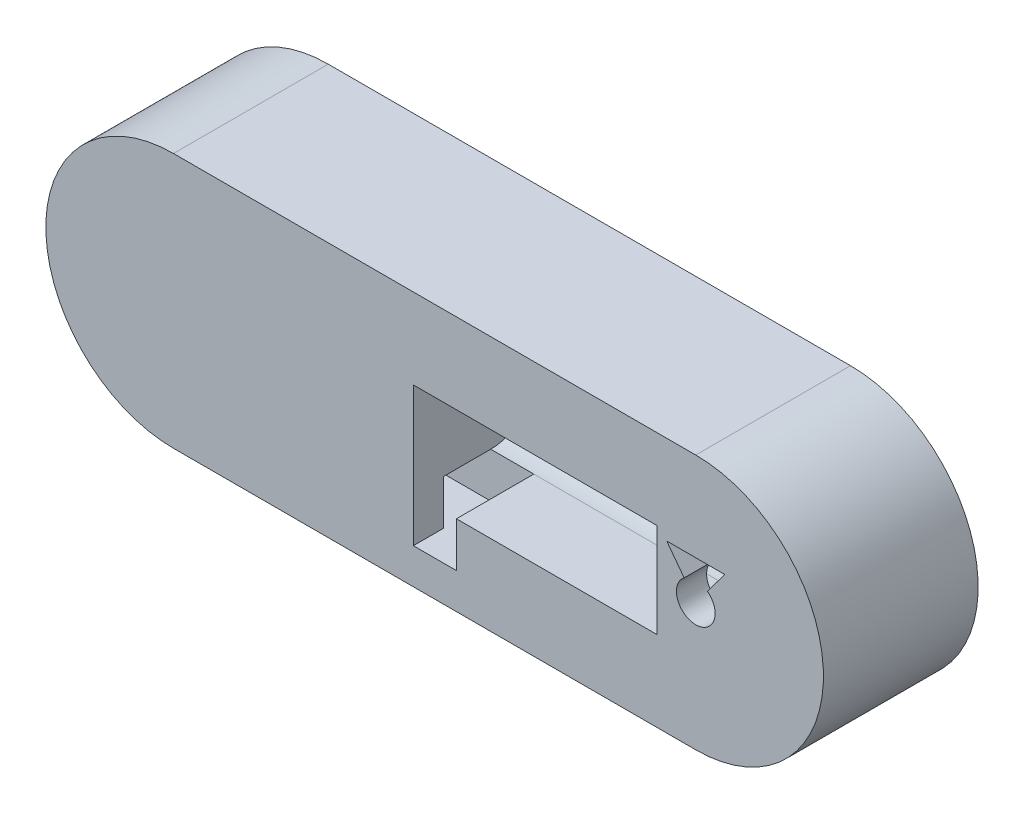
ISO-10303-21;
HEADER;
FILE_DESCRIPTION(('STEP AP214'),'2;1');
FILE_NAME('part.step','',(''),(''),'','','');
FILE_SCHEMA(('AUTOMOTIVE_DESIGN { 1 0 10303 214 1 1 1 1 }'));
ENDSEC;
DATA;
#1=APPLICATION_CONTEXT('core data for automotive mechanical design processes');
#2=APPLICATION_PROTOCOL_DEFINITION('international standard','automotive_design',2000,#1);
#3=PRODUCT_CONTEXT('',#1,'mechanical');
#4=PRODUCT('Part','Part','',(#3));
#5=PRODUCT_RELATED_PRODUCT_CATEGORY('part','',(#4));
#6=PRODUCT_DEFINITION_FORMATION('','',#4);
#7=PRODUCT_DEFINITION_CONTEXT('part definition',#1,'design');
#8=PRODUCT_DEFINITION('design','',#6,#7);
#9=PRODUCT_DEFINITION_SHAPE('','',#8);
#10=(LENGTH_UNIT() NAMED_UNIT(*) SI_UNIT(.MILLI.,.METRE.));
#11=(NAMED_UNIT(*) PLANE_ANGLE_UNIT() SI_UNIT($,.RADIAN.));
#12=(NAMED_UNIT(*) SI_UNIT($,.STERADIAN.) SOLID_ANGLE_UNIT());
#13=UNCERTAINTY_MEASURE_WITH_UNIT(LENGTH_MEASURE(1.E-05),#10,'distance_accuracy_value','');
#14=(GEOMETRIC_REPRESENTATION_CONTEXT(3) GLOBAL_UNCERTAINTY_ASSIGNED_CONTEXT((#13)) GLOBAL_UNIT_ASSIGNED_CONTEXT((#10,
#11,#12)) REPRESENTATION_CONTEXT('',''));
#15=CARTESIAN_POINT('',(0.,0.,0.));
#16=DIRECTION('',(0.,0.,1.));
#17=DIRECTION('',(1.,0.,0.));
#18=AXIS2_PLACEMENT_3D('',#15,#16,#17);
#19=CARTESIAN_POINT('',(3.97288903810641,0.,20.));
#20=DIRECTION('',(-1.,0.,0.));
#21=DIRECTION('',(0.,-1.,0.));
#22=AXIS2_PLACEMENT_3D('',#19,#20,#21);
#23=PLANE('',#22);
#24=DIRECTION('',(0.,0.,1.));
#25=VECTOR('',#24,1.);
#26=CARTESIAN_POINT('',(3.97288903810642,-12.2,0.));
#27=LINE('',#26,#25);
#28=CARTESIAN_POINT('',(3.97288903810642,-12.2,20.));
#29=VERTEX_POINT('',#28);
#30=CARTESIAN_POINT('',(3.97288903810642,-12.2,32.2));
#31=VERTEX_POINT('',#30);
#32=EDGE_CURVE('E340',#29,#31,#27,.T.);
#33=ORIENTED_EDGE('',*,*,#32,.F.);
#34=CARTESIAN_POINT('',(3.97288903810641,0.,20.));
#35=DIRECTION('',(1.,0.,0.));
#36=DIRECTION('',(0.,1.,0.));
#37=AXIS2_PLACEMENT_3D('',#34,#35,#36);
#38=CIRCLE('',#37,12.2);
#39=CARTESIAN_POINT('',(3.97288903810641,12.2,20.));
#40=VERTEX_POINT('',#39);
#41=EDGE_CURVE('E440',#29,#40,#38,.T.);
#42=ORIENTED_EDGE('',*,*,#41,.T.);
#43=DIRECTION('',(0.,0.,1.));
#44=VECTOR('',#43,1.);
#45=CARTESIAN_POINT('',(3.97288903810641,12.2,20.));
#46=LINE('',#45,#44);
#47=CARTESIAN_POINT('',(3.97288903810641,12.2,40.));
#48=VERTEX_POINT('',#47);
#49=EDGE_CURVE('E496',#40,#48,#46,.T.);
#50=ORIENTED_EDGE('',*,*,#49,.T.);
#51=DIRECTION('',(0.,-1.,0.));
#52=VECTOR('',#51,1.);
#53=CARTESIAN_POINT('',(3.97288903810641,0.,40.));
#54=LINE('',#53,#52);
#55=CARTESIAN_POINT('',(3.97288903810642,-23.8,40.));
#56=VERTEX_POINT('',#55);
#57=EDGE_CURVE('E466',#48,#56,#54,.T.);
#58=ORIENTED_EDGE('',*,*,#57,.T.);
#59=DIRECTION('',(0.,0.,1.));
#60=VECTOR('',#59,1.);
#61=CARTESIAN_POINT('',(3.97288903810642,-23.8,20.));
#62=LINE('',#61,#60);
#63=CARTESIAN_POINT('',(3.97288903810642,-23.8,32.2));
#64=VERTEX_POINT('',#63);
#65=EDGE_CURVE('E491',#64,#56,#62,.T.);
#66=ORIENTED_EDGE('',*,*,#65,.F.);
#67=DIRECTION('',(0.,-1.,0.));
#68=VECTOR('',#67,1.);
#69=CARTESIAN_POINT('',(3.97288903810641,0.,32.2));
#70=LINE('',#69,#68);
#71=EDGE_CURVE('E654',#31,#64,#70,.T.);
#72=ORIENTED_EDGE('',*,*,#71,.F.);
#73=EDGE_LOOP('',(#33,#42,#50,#58,#66,#72));
#74=FACE_BOUND('',#73,.T.);
#75=ADVANCED_FACE('F126',(#74),#23,.F.);
#76=CARTESIAN_POINT('',(76.9728890381064,0.,40.));
#77=DIRECTION('',(0.,0.,-1.));
#78=DIRECTION('',(-1.,0.,0.));
#79=AXIS2_PLACEMENT_3D('',#76,#77,#78);
#80=CYLINDRICAL_SURFACE('',#79,5.);
#81=DIRECTION('',(0.,0.,-1.));
#82=VECTOR('',#81,1.);
#83=CARTESIAN_POINT('',(73.9728890381064,4.,40.));
#84=LINE('',#83,#82);
#85=CARTESIAN_POINT('',(73.9728890381064,4.,7.80000000000001));
#86=VERTEX_POINT('',#85);
#87=CARTESIAN_POINT('',(73.9728890381064,4.,0.));
#88=VERTEX_POINT('',#87);
#89=EDGE_CURVE('E596',#86,#88,#84,.T.);
#90=ORIENTED_EDGE('',*,*,#89,.F.);
#91=CARTESIAN_POINT('',(76.9728890381064,0.,7.80000000000001));
#92=DIRECTION('',(0.,0.,1.));
#93=DIRECTION('',(1.,0.,0.));
#94=AXIS2_PLACEMENT_3D('',#91,#92,#93);
#95=CIRCLE('',#94,5.);
#96=CARTESIAN_POINT('',(79.9728890381064,4.,7.80000000000001));
#97=VERTEX_POINT('',#96);
#98=EDGE_CURVE('E421',#86,#97,#95,.T.);
#99=ORIENTED_EDGE('',*,*,#98,.T.);
#100=DIRECTION('',(0.,0.,-1.));
#101=VECTOR('',#100,1.);
#102=CARTESIAN_POINT('',(79.9728890381064,4.,40.));
#103=LINE('',#102,#101);
#104=CARTESIAN_POINT('',(79.9728890381064,4.,0.));
#105=VERTEX_POINT('',#104);
#106=EDGE_CURVE('E587',#97,#105,#103,.T.);
#107=ORIENTED_EDGE('',*,*,#106,.T.);
#108=CARTESIAN_POINT('',(76.9728890381064,0.,0.));
#109=DIRECTION('',(0.,0.,1.));
#110=DIRECTION('',(1.,0.,0.));
#111=AXIS2_PLACEMENT_3D('',#108,#109,#110);
#112=CIRCLE('',#111,5.);
#113=EDGE_CURVE('E568',#88,#105,#112,.T.);
#114=ORIENTED_EDGE('',*,*,#113,.F.);
#115=EDGE_LOOP('',(#90,#99,#107,#114));
#116=FACE_BOUND('',#115,.T.);
#117=ADVANCED_FACE('F909',(#116),#80,.F.);
#118=CARTESIAN_POINT('',(49.2626489843882,36.9469867382911,40.));
#119=DIRECTION('',(0.800000000000001,0.599999999999999,0.));
#120=DIRECTION('',(-0.599999999999999,0.800000000000001,0.));
#121=AXIS2_PLACEMENT_3D('',#118,#119,#120);
#122=PLANE('',#121);
#123=DIRECTION('',(0.,0.,-1.));
#124=VECTOR('',#123,1.);
#125=CARTESIAN_POINT('',(69.4728890381064,9.99999999999999,40.));
#126=LINE('',#125,#124);
#127=CARTESIAN_POINT('',(69.4728890381064,10.,7.80000000000001));
#128=VERTEX_POINT('',#127);
#129=CARTESIAN_POINT('',(69.4728890381064,9.99999999999999,0.));
#130=VERTEX_POINT('',#129);
#131=EDGE_CURVE('E595',#128,#130,#126,.T.);
#132=ORIENTED_EDGE('',*,*,#131,.F.);
#133=DIRECTION('',(0.599999999999999,-0.800000000000001,0.));
#134=VECTOR('',#133,1.);
#135=CARTESIAN_POINT('',(49.2626489843882,36.9469867382911,7.80000000000001));
#136=LINE('',#135,#134);
#137=EDGE_CURVE('E418',#128,#86,#136,.T.);
#138=ORIENTED_EDGE('',*,*,#137,.T.);
#139=ORIENTED_EDGE('',*,*,#89,.T.);
#140=DIRECTION('',(0.599999999999999,-0.800000000000001,0.));
#141=VECTOR('',#140,1.);
#142=CARTESIAN_POINT('',(49.2626489843882,36.9469867382911,0.));
#143=LINE('',#142,#141);
#144=EDGE_CURVE('E575',#130,#88,#143,.T.);
#145=ORIENTED_EDGE('',*,*,#144,.F.);
#146=EDGE_LOOP('',(#132,#138,#139,#145));
#147=FACE_BOUND('',#146,.T.);
#148=ADVANCED_FACE('F906',(#147),#122,.T.);
#149=CARTESIAN_POINT('',(0.,10.,40.));
#150=DIRECTION('',(0.,-1.,0.));
#151=DIRECTION('',(0.,0.,-1.));
#152=AXIS2_PLACEMENT_3D('',#149,#150,#151);
#153=PLANE('',#152);
#154=DIRECTION('',(0.,0.,-1.));
#155=VECTOR('',#154,1.);
#156=CARTESIAN_POINT('',(84.4728890381064,9.99999999999999,40.));
#157=LINE('',#156,#155);
#158=CARTESIAN_POINT('',(84.4728890381064,9.99999999999999,7.80000000000001));
#159=VERTEX_POINT('',#158);
#160=CARTESIAN_POINT('',(84.4728890381064,9.99999999999999,0.));
#161=VERTEX_POINT('',#160);
#162=EDGE_CURVE('E589',#159,#161,#157,.T.);
#163=ORIENTED_EDGE('',*,*,#162,.F.);
#164=DIRECTION('',(-1.,0.,0.));
#165=VECTOR('',#164,1.);
#166=CARTESIAN_POINT('',(0.,10.,7.80000000000001));
#167=LINE('',#166,#165);
#168=EDGE_CURVE('E411',#159,#128,#167,.T.);
#169=ORIENTED_EDGE('',*,*,#168,.T.);
#170=ORIENTED_EDGE('',*,*,#131,.T.);
#171=DIRECTION('',(-1.,0.,0.));
#172=VECTOR('',#171,1.);
#173=CARTESIAN_POINT('',(0.,10.,0.));
#174=LINE('',#173,#172);
#175=EDGE_CURVE('E577',#161,#130,#174,.T.);
#176=ORIENTED_EDGE('',*,*,#175,.F.);
#177=EDGE_LOOP('',(#163,#169,#170,#176));
#178=FACE_BOUND('',#177,.T.);
#179=ADVANCED_FACE('F919',(#178),#153,.T.);
#180=CARTESIAN_POINT('',(49.2626489843881,-36.9469867382911,40.));
#181=DIRECTION('',(-0.8,0.6,0.));
#182=DIRECTION('',(-0.6,-0.8,0.));
#183=AXIS2_PLACEMENT_3D('',#180,#181,#182);
#184=PLANE('',#183);
#185=ORIENTED_EDGE('',*,*,#106,.F.);
#186=DIRECTION('',(0.6,0.8,0.));
#187=VECTOR('',#186,1.);
#188=CARTESIAN_POINT('',(49.2626489843881,-36.9469867382911,7.80000000000001));
#189=LINE('',#188,#187);
#190=EDGE_CURVE('E405',#97,#159,#189,.T.);
#191=ORIENTED_EDGE('',*,*,#190,.T.);
#192=ORIENTED_EDGE('',*,*,#162,.T.);
#193=DIRECTION('',(0.6,0.8,0.));
#194=VECTOR('',#193,1.);
#195=CARTESIAN_POINT('',(49.2626489843881,-36.9469867382911,0.));
#196=LINE('',#195,#194);
#197=EDGE_CURVE('E526',#105,#161,#196,.T.);
#198=ORIENTED_EDGE('',*,*,#197,.F.);
#199=EDGE_LOOP('',(#185,#191,#192,#198));
#200=FACE_BOUND('',#199,.T.);
#201=ADVANCED_FACE('F918',(#200),#184,.T.);
#202=CARTESIAN_POINT('',(66.9728890381064,0.,20.));
#203=DIRECTION('',(1.,0.,0.));
#204=DIRECTION('',(0.,0.,-1.));
#205=AXIS2_PLACEMENT_3D('',#202,#203,#204);
#206=PLANE('',#205);
#207=DIRECTION('',(0.,1.,0.));
#208=VECTOR('',#207,1.);
#209=CARTESIAN_POINT('',(66.9728890381064,0.,32.2));
#210=LINE('',#209,#208);
#211=CARTESIAN_POINT('',(66.9728890381064,-12.2,32.2));
#212=VERTEX_POINT('',#211);
#213=CARTESIAN_POINT('',(66.9728890381064,12.2,32.2));
#214=VERTEX_POINT('',#213);
#215=EDGE_CURVE('E387',#212,#214,#210,.T.);
#216=ORIENTED_EDGE('',*,*,#215,.F.);
#217=DIRECTION('',(0.,0.,1.));
#218=VECTOR('',#217,1.);
#219=CARTESIAN_POINT('',(66.9728890381064,-12.2,20.));
#220=LINE('',#219,#218);
#221=CARTESIAN_POINT('',(66.9728890381064,-12.2,40.));
#222=VERTEX_POINT('',#221);
#223=EDGE_CURVE('E485',#212,#222,#220,.T.);
#224=ORIENTED_EDGE('',*,*,#223,.T.);
#225=DIRECTION('',(0.,1.,0.));
#226=VECTOR('',#225,1.);
#227=CARTESIAN_POINT('',(66.9728890381064,0.,40.));
#228=LINE('',#227,#226);
#229=CARTESIAN_POINT('',(66.9728890381064,12.2,40.));
#230=VERTEX_POINT('',#229);
#231=EDGE_CURVE('E441',#222,#230,#228,.T.);
#232=ORIENTED_EDGE('',*,*,#231,.T.);
#233=DIRECTION('',(0.,0.,1.));
#234=VECTOR('',#233,1.);
#235=CARTESIAN_POINT('',(66.9728890381064,12.2,20.));
#236=LINE('',#235,#234);
#237=EDGE_CURVE('E456',#214,#230,#236,.T.);
#238=ORIENTED_EDGE('',*,*,#237,.F.);
#239=EDGE_LOOP('',(#216,#224,#232,#238));
#240=FACE_BOUND('',#239,.T.);
#241=ADVANCED_FACE('F699',(#240),#206,.F.);
#242=CARTESIAN_POINT('',(0.,0.,20.));
#243=DIRECTION('',(0.,0.,1.));
#244=DIRECTION('',(1.,0.,0.));
#245=AXIS2_PLACEMENT_3D('',#242,#243,#244);
#246=PLANE('',#245);
#247=DIRECTION('',(0.,1.,0.));
#248=VECTOR('',#247,1.);
#249=CARTESIAN_POINT('',(-34.4271109618936,0.,20.));
#250=LINE('',#249,#248);
#251=CARTESIAN_POINT('',(-34.4271109618936,-23.8,20.));
#252=VERTEX_POINT('',#251);
#253=CARTESIAN_POINT('',(-34.4271109618936,-12.2,20.));
#254=VERTEX_POINT('',#253);
#255=EDGE_CURVE('E329',#252,#254,#250,.T.);
#256=ORIENTED_EDGE('',*,*,#255,.F.);
#257=DIRECTION('',(1.,0.,0.));
#258=VECTOR('',#257,1.);
#259=CARTESIAN_POINT('',(0.,-23.8,20.));
#260=LINE('',#259,#258);
#261=CARTESIAN_POINT('',(15.1104475181307,-23.8,20.));
#262=VERTEX_POINT('',#261);
#263=EDGE_CURVE('E446',#252,#262,#260,.T.);
#264=ORIENTED_EDGE('',*,*,#263,.T.);
#265=DIRECTION('',(0.,1.,0.));
#266=VECTOR('',#265,1.);
#267=CARTESIAN_POINT('',(15.1104475181307,0.,20.));
#268=LINE('',#267,#266);
#269=CARTESIAN_POINT('',(15.1104475181307,-12.2,20.));
#270=VERTEX_POINT('',#269);
#271=EDGE_CURVE('E454',#262,#270,#268,.T.);
#272=ORIENTED_EDGE('',*,*,#271,.T.);
#273=DIRECTION('',(-1.,0.,0.));
#274=VECTOR('',#273,1.);
#275=CARTESIAN_POINT('',(107.373384084578,-12.2,20.));
#276=LINE('',#275,#274);
#277=EDGE_CURVE('E350',#270,#29,#276,.T.);
#278=ORIENTED_EDGE('',*,*,#277,.T.);
#279=DIRECTION('',(1.,0.,0.));
#280=VECTOR('',#279,1.);
#281=CARTESIAN_POINT('',(-46.0271109618936,-12.2,20.));
#282=LINE('',#281,#280);
#283=EDGE_CURVE('E341',#254,#29,#282,.T.);
#284=ORIENTED_EDGE('',*,*,#283,.F.);
#285=EDGE_LOOP('',(#256,#264,#272,#278,#284));
#286=FACE_BOUND('',#285,.T.);
#287=ADVANCED_FACE('F349',(#286),#246,.T.);
#288=CARTESIAN_POINT('',(0.,0.,0.));
#289=DIRECTION('',(0.,0.,1.));
#290=DIRECTION('',(1.,0.,0.));
#291=AXIS2_PLACEMENT_3D('',#288,#289,#290);
#292=PLANE('',#291);
#293=DIRECTION('',(1.,0.,0.));
#294=VECTOR('',#293,1.);
#295=CARTESIAN_POINT('',(0.,-12.2,0.));
#296=LINE('',#295,#294);
#297=CARTESIAN_POINT('',(-56.0271109618936,-12.2,0.));
#298=VERTEX_POINT('',#297);
#299=CARTESIAN_POINT('',(-34.4271109618936,-12.2,0.));
#300=VERTEX_POINT('',#299);
#301=EDGE_CURVE('E141',#298,#300,#296,.T.);
#302=ORIENTED_EDGE('',*,*,#301,.F.);
#303=DIRECTION('',(0.,-1.,0.));
#304=VECTOR('',#303,1.);
#305=CARTESIAN_POINT('',(-56.0271109618936,-23.8,0.));
#306=LINE('',#305,#304);
#307=CARTESIAN_POINT('',(-56.0271109618936,-23.8,0.));
#308=VERTEX_POINT('',#307);
#309=EDGE_CURVE('E622',#298,#308,#306,.T.);
#310=ORIENTED_EDGE('',*,*,#309,.T.);
#311=DIRECTION('',(-1.,0.,0.));
#312=VECTOR('',#311,1.);
#313=CARTESIAN_POINT('',(0.,-23.7999999999999,0.));
#314=LINE('',#313,#312);
#315=CARTESIAN_POINT('',(-34.4271109618936,-23.8,0.));
#316=VERTEX_POINT('',#315);
#317=EDGE_CURVE('E150',#316,#308,#314,.T.);
#318=ORIENTED_EDGE('',*,*,#317,.F.);
#319=DIRECTION('',(0.,1.,0.));
#320=VECTOR('',#319,1.);
#321=CARTESIAN_POINT('',(-34.4271109618936,0.,0.));
#322=LINE('',#321,#320);
#323=EDGE_CURVE('E343',#316,#300,#322,.T.);
#324=ORIENTED_EDGE('',*,*,#323,.T.);
#325=EDGE_LOOP('',(#302,#310,#318,#324));
#326=FACE_BOUND('',#325,.T.);
#327=CARTESIAN_POINT('',(-58.0271109618936,0.,0.));
#328=DIRECTION('',(0.,0.,1.));
#329=DIRECTION('',(1.,0.,0.));
#330=AXIS2_PLACEMENT_3D('',#327,#328,#329);
#331=CIRCLE('',#330,33.);
#332=CARTESIAN_POINT('',(-58.0271109618936,33.,0.));
#333=VERTEX_POINT('',#332);
#334=CARTESIAN_POINT('',(-58.0271109618936,-33.,0.));
#335=VERTEX_POINT('',#334);
#336=EDGE_CURVE('E523',#333,#335,#331,.T.);
#337=ORIENTED_EDGE('',*,*,#336,.F.);
#338=DIRECTION('',(1.,0.,0.));
#339=VECTOR('',#338,1.);
#340=CARTESIAN_POINT('',(0.,33.,0.));
#341=LINE('',#340,#339);
#342=CARTESIAN_POINT('',(76.9728890381064,33.,0.));
#343=VERTEX_POINT('',#342);
#344=EDGE_CURVE('E562',#333,#343,#341,.T.);
#345=ORIENTED_EDGE('',*,*,#344,.T.);
#346=CARTESIAN_POINT('',(76.9728890381064,0.,0.));
#347=DIRECTION('',(0.,0.,1.));
#348=DIRECTION('',(1.,0.,0.));
#349=AXIS2_PLACEMENT_3D('',#346,#347,#348);
#350=CIRCLE('',#349,33.);
#351=CARTESIAN_POINT('',(76.9728890381064,-33.,0.));
#352=VERTEX_POINT('',#351);
#353=EDGE_CURVE('E557',#352,#343,#350,.T.);
#354=ORIENTED_EDGE('',*,*,#353,.F.);
#355=DIRECTION('',(1.,0.,0.));
#356=VECTOR('',#355,1.);
#357=CARTESIAN_POINT('',(0.,-33.,0.));
#358=LINE('',#357,#356);
#359=EDGE_CURVE('E560',#335,#352,#358,.T.);
#360=ORIENTED_EDGE('',*,*,#359,.F.);
#361=EDGE_LOOP('',(#337,#345,#354,#360));
#362=FACE_BOUND('',#361,.T.);
#363=ORIENTED_EDGE('',*,*,#113,.T.);
#364=ORIENTED_EDGE('',*,*,#197,.T.);
#365=ORIENTED_EDGE('',*,*,#175,.T.);
#366=ORIENTED_EDGE('',*,*,#144,.T.);
#367=EDGE_LOOP('',(#363,#364,#365,#366));
#368=FACE_BOUND('',#367,.T.);
#369=CARTESIAN_POINT('',(-58.0271109618936,0.,0.));
#370=DIRECTION('',(0.,0.,1.));
#371=DIRECTION('',(1.,0.,0.));
#372=AXIS2_PLACEMENT_3D('',#369,#370,#371);
#373=CIRCLE('',#372,5.);
#374=CARTESIAN_POINT('',(-54.2340584549536,3.257722007722,0.));
#375=VERTEX_POINT('',#374);
#376=CARTESIAN_POINT('',(-54.2340584549536,-3.257722007722,0.));
#377=VERTEX_POINT('',#376);
#378=EDGE_CURVE('E506',#375,#377,#373,.T.);
#379=ORIENTED_EDGE('',*,*,#378,.T.);
#380=DIRECTION('',(0.,-1.,0.));
#381=VECTOR('',#380,1.);
#382=CARTESIAN_POINT('',(-54.2340584549536,0.,0.));
#383=LINE('',#382,#381);
#384=EDGE_CURVE('E488',#375,#377,#383,.T.);
#385=ORIENTED_EDGE('',*,*,#384,.F.);
#386=EDGE_LOOP('',(#379,#385));
#387=FACE_BOUND('',#386,.T.);
#388=ADVANCED_FACE('F640',(#326,#362,#368,#387),#292,.F.);
#389=CARTESIAN_POINT('',(76.9728890381064,0.,32.2));
#390=DIRECTION('',(0.,0.,1.));
#391=DIRECTION('',(1.,0.,0.));
#392=AXIS2_PLACEMENT_3D('',#389,#390,#391);
#393=CIRCLE('',#392,5.);
#394=CARTESIAN_POINT('',(73.9728890381064,4.,32.2));
#395=VERTEX_POINT('',#394);
#396=CARTESIAN_POINT('',(79.9728890381064,4.,32.2));
#397=VERTEX_POINT('',#396);
#398=EDGE_CURVE('E433',#395,#397,#393,.T.);
#399=ORIENTED_EDGE('',*,*,#398,.F.);
#400=CARTESIAN_POINT('',(73.9728890381064,4.,40.));
#401=VERTEX_POINT('',#400);
#402=EDGE_CURVE('E599',#401,#395,#84,.T.);
#403=ORIENTED_EDGE('',*,*,#402,.F.);
#404=CARTESIAN_POINT('',(76.9728890381064,0.,40.));
#405=DIRECTION('',(0.,0.,1.));
#406=DIRECTION('',(1.,0.,0.));
#407=AXIS2_PLACEMENT_3D('',#404,#405,#406);
#408=CIRCLE('',#407,5.);
#409=CARTESIAN_POINT('',(79.9728890381064,4.,40.));
#410=VERTEX_POINT('',#409);
#411=EDGE_CURVE('E537',#401,#410,#408,.T.);
#412=ORIENTED_EDGE('',*,*,#411,.T.);
#413=EDGE_CURVE('E584',#410,#397,#103,.T.);
#414=ORIENTED_EDGE('',*,*,#413,.T.);
#415=EDGE_LOOP('',(#399,#403,#412,#414));
#416=FACE_BOUND('',#415,.T.);
#417=ADVANCED_FACE('F942',(#416),#80,.F.);
#418=DIRECTION('',(0.599999999999999,-0.800000000000001,0.));
#419=VECTOR('',#418,1.);
#420=CARTESIAN_POINT('',(49.2626489843882,36.9469867382911,32.2));
#421=LINE('',#420,#419);
#422=CARTESIAN_POINT('',(69.4728890381064,10.,32.2));
#423=VERTEX_POINT('',#422);
#424=EDGE_CURVE('E427',#423,#395,#421,.T.);
#425=ORIENTED_EDGE('',*,*,#424,.F.);
#426=CARTESIAN_POINT('',(69.4728890381064,9.99999999999999,40.));
#427=VERTEX_POINT('',#426);
#428=EDGE_CURVE('E593',#427,#423,#126,.T.);
#429=ORIENTED_EDGE('',*,*,#428,.F.);
#430=DIRECTION('',(0.599999999999999,-0.800000000000001,0.));
#431=VECTOR('',#430,1.);
#432=CARTESIAN_POINT('',(49.2626489843882,36.9469867382911,40.));
#433=LINE('',#432,#431);
#434=EDGE_CURVE('E543',#427,#401,#433,.T.);
#435=ORIENTED_EDGE('',*,*,#434,.T.);
#436=ORIENTED_EDGE('',*,*,#402,.T.);
#437=EDGE_LOOP('',(#425,#429,#435,#436));
#438=FACE_BOUND('',#437,.T.);
#439=ADVANCED_FACE('F970',(#438),#122,.T.);
#440=DIRECTION('',(-1.,0.,0.));
#441=VECTOR('',#440,1.);
#442=CARTESIAN_POINT('',(0.,10.,32.2));
#443=LINE('',#442,#441);
#444=CARTESIAN_POINT('',(84.4728890381064,9.99999999999999,32.2));
#445=VERTEX_POINT('',#444);
#446=EDGE_CURVE('E430',#445,#423,#443,.T.);
#447=ORIENTED_EDGE('',*,*,#446,.F.);
#448=CARTESIAN_POINT('',(84.4728890381064,9.99999999999999,40.));
#449=VERTEX_POINT('',#448);
#450=EDGE_CURVE('E590',#449,#445,#157,.T.);
#451=ORIENTED_EDGE('',*,*,#450,.F.);
#452=DIRECTION('',(-1.,0.,0.));
#453=VECTOR('',#452,1.);
#454=CARTESIAN_POINT('',(0.,10.,40.));
#455=LINE('',#454,#453);
#456=EDGE_CURVE('E541',#449,#427,#455,.T.);
#457=ORIENTED_EDGE('',*,*,#456,.T.);
#458=ORIENTED_EDGE('',*,*,#428,.T.);
#459=EDGE_LOOP('',(#447,#451,#457,#458));
#460=FACE_BOUND('',#459,.T.);
#461=ADVANCED_FACE('F928',(#460),#153,.T.);
#462=CARTESIAN_POINT('',(-58.0271109618936,0.,40.));
#463=DIRECTION('',(0.,0.,-1.));
#464=DIRECTION('',(-1.,0.,0.));
#465=AXIS2_PLACEMENT_3D('',#462,#463,#464);
#466=CYLINDRICAL_SURFACE('',#465,33.);
#467=ORIENTED_EDGE('',*,*,#336,.T.);
#468=DIRECTION('',(0.,0.,-1.));
#469=VECTOR('',#468,1.);
#470=CARTESIAN_POINT('',(-58.0271109618936,-33.,40.));
#471=LINE('',#470,#469);
#472=CARTESIAN_POINT('',(-58.0271109618936,-33.,40.));
#473=VERTEX_POINT('',#472);
#474=EDGE_CURVE('E611',#473,#335,#471,.T.);
#475=ORIENTED_EDGE('',*,*,#474,.F.);
#476=CARTESIAN_POINT('',(-58.0271109618936,0.,40.));
#477=DIRECTION('',(0.,0.,1.));
#478=DIRECTION('',(1.,0.,0.));
#479=AXIS2_PLACEMENT_3D('',#476,#477,#478);
#480=CIRCLE('',#479,33.);
#481=CARTESIAN_POINT('',(-58.0271109618936,33.,40.));
#482=VERTEX_POINT('',#481);
#483=EDGE_CURVE('E524',#482,#473,#480,.T.);
#484=ORIENTED_EDGE('',*,*,#483,.F.);
#485=DIRECTION('',(0.,0.,-1.));
#486=VECTOR('',#485,1.);
#487=CARTESIAN_POINT('',(-58.0271109618936,33.,40.));
#488=LINE('',#487,#486);
#489=EDGE_CURVE('E551',#482,#333,#488,.T.);
#490=ORIENTED_EDGE('',*,*,#489,.T.);
#491=EDGE_LOOP('',(#467,#475,#484,#490));
#492=FACE_BOUND('',#491,.T.);
#493=ADVANCED_FACE('F1195',(#492),#466,.T.);
#494=CARTESIAN_POINT('',(0.,-33.,40.));
#495=DIRECTION('',(0.,1.,0.));
#496=DIRECTION('',(0.,0.,1.));
#497=AXIS2_PLACEMENT_3D('',#494,#495,#496);
#498=PLANE('',#497);
#499=ORIENTED_EDGE('',*,*,#359,.T.);
#500=DIRECTION('',(0.,0.,-1.));
#501=VECTOR('',#500,1.);
#502=CARTESIAN_POINT('',(76.9728890381064,-33.,40.));
#503=LINE('',#502,#501);
#504=CARTESIAN_POINT('',(76.9728890381064,-33.,40.));
#505=VERTEX_POINT('',#504);
#506=EDGE_CURVE('E607',#505,#352,#503,.T.);
#507=ORIENTED_EDGE('',*,*,#506,.F.);
#508=DIRECTION('',(1.,0.,0.));
#509=VECTOR('',#508,1.);
#510=CARTESIAN_POINT('',(0.,-33.,40.));
#511=LINE('',#510,#509);
#512=EDGE_CURVE('E529',#473,#505,#511,.T.);
#513=ORIENTED_EDGE('',*,*,#512,.F.);
#514=ORIENTED_EDGE('',*,*,#474,.T.);
#515=EDGE_LOOP('',(#499,#507,#513,#514));
#516=FACE_BOUND('',#515,.T.);
#517=ADVANCED_FACE('F1183',(#516),#498,.F.);
#518=CARTESIAN_POINT('',(76.9728890381064,0.,40.));
#519=DIRECTION('',(0.,0.,-1.));
#520=DIRECTION('',(-1.,0.,0.));
#521=AXIS2_PLACEMENT_3D('',#518,#519,#520);
#522=CYLINDRICAL_SURFACE('',#521,33.);
#523=ORIENTED_EDGE('',*,*,#353,.T.);
#524=DIRECTION('',(0.,0.,-1.));
#525=VECTOR('',#524,1.);
#526=CARTESIAN_POINT('',(76.9728890381064,33.,40.));
#527=LINE('',#526,#525);
#528=CARTESIAN_POINT('',(76.9728890381064,33.,40.));
#529=VERTEX_POINT('',#528);
#530=EDGE_CURVE('E605',#529,#343,#527,.T.);
#531=ORIENTED_EDGE('',*,*,#530,.F.);
#532=CARTESIAN_POINT('',(76.9728890381064,0.,40.));
#533=DIRECTION('',(0.,0.,1.));
#534=DIRECTION('',(1.,0.,0.));
#535=AXIS2_PLACEMENT_3D('',#532,#533,#534);
#536=CIRCLE('',#535,33.);
#537=EDGE_CURVE('E527',#505,#529,#536,.T.);
#538=ORIENTED_EDGE('',*,*,#537,.F.);
#539=ORIENTED_EDGE('',*,*,#506,.T.);
#540=EDGE_LOOP('',(#523,#531,#538,#539));
#541=FACE_BOUND('',#540,.T.);
#542=ADVANCED_FACE('F1179',(#541),#522,.T.);
#543=CARTESIAN_POINT('',(0.,33.,40.));
#544=DIRECTION('',(0.,1.,0.));
#545=DIRECTION('',(0.,0.,1.));
#546=AXIS2_PLACEMENT_3D('',#543,#544,#545);
#547=PLANE('',#546);
#548=ORIENTED_EDGE('',*,*,#344,.F.);
#549=ORIENTED_EDGE('',*,*,#489,.F.);
#550=DIRECTION('',(1.,0.,0.));
#551=VECTOR('',#550,1.);
#552=CARTESIAN_POINT('',(0.,33.,40.));
#553=LINE('',#552,#551);
#554=EDGE_CURVE('E531',#482,#529,#553,.T.);
#555=ORIENTED_EDGE('',*,*,#554,.T.);
#556=ORIENTED_EDGE('',*,*,#530,.T.);
#557=EDGE_LOOP('',(#548,#549,#555,#556));
#558=FACE_BOUND('',#557,.T.);
#559=ADVANCED_FACE('F934',(#558),#547,.T.);
#560=DIRECTION('',(0.6,0.8,0.));
#561=VECTOR('',#560,1.);
#562=CARTESIAN_POINT('',(49.2626489843881,-36.9469867382911,32.2));
#563=LINE('',#562,#561);
#564=EDGE_CURVE('E616',#397,#445,#563,.T.);
#565=ORIENTED_EDGE('',*,*,#564,.F.);
#566=ORIENTED_EDGE('',*,*,#413,.F.);
#567=DIRECTION('',(0.6,0.8,0.));
#568=VECTOR('',#567,1.);
#569=CARTESIAN_POINT('',(49.2626489843881,-36.9469867382911,40.));
#570=LINE('',#569,#568);
#571=EDGE_CURVE('E548',#410,#449,#570,.T.);
#572=ORIENTED_EDGE('',*,*,#571,.T.);
#573=ORIENTED_EDGE('',*,*,#450,.T.);
#574=EDGE_LOOP('',(#565,#566,#572,#573));
#575=FACE_BOUND('',#574,.T.);
#576=ADVANCED_FACE('F925',(#575),#184,.T.);
#577=CARTESIAN_POINT('',(0.,0.,40.));
#578=DIRECTION('',(0.,0.,1.));
#579=DIRECTION('',(1.,0.,0.));
#580=AXIS2_PLACEMENT_3D('',#577,#578,#579);
#581=PLANE('',#580);
#582=ORIENTED_EDGE('',*,*,#231,.F.);
#583=DIRECTION('',(1.,0.,0.));
#584=VECTOR('',#583,1.);
#585=CARTESIAN_POINT('',(0.,-12.2,40.));
#586=LINE('',#585,#584);
#587=CARTESIAN_POINT('',(15.1104475181307,-12.2,40.));
#588=VERTEX_POINT('',#587);
#589=EDGE_CURVE('E448',#588,#222,#586,.T.);
#590=ORIENTED_EDGE('',*,*,#589,.F.);
#591=DIRECTION('',(0.,1.,0.));
#592=VECTOR('',#591,1.);
#593=CARTESIAN_POINT('',(15.1104475181307,0.,40.));
#594=LINE('',#593,#592);
#595=CARTESIAN_POINT('',(15.1104475181307,-23.8,40.));
#596=VERTEX_POINT('',#595);
#597=EDGE_CURVE('E478',#596,#588,#594,.T.);
#598=ORIENTED_EDGE('',*,*,#597,.F.);
#599=DIRECTION('',(1.,0.,0.));
#600=VECTOR('',#599,1.);
#601=CARTESIAN_POINT('',(0.,-23.8,40.));
#602=LINE('',#601,#600);
#603=EDGE_CURVE('E472',#56,#596,#602,.T.);
#604=ORIENTED_EDGE('',*,*,#603,.F.);
#605=ORIENTED_EDGE('',*,*,#57,.F.);
#606=DIRECTION('',(-1.,0.,0.));
#607=VECTOR('',#606,1.);
#608=CARTESIAN_POINT('',(0.,12.2,40.));
#609=LINE('',#608,#607);
#610=EDGE_CURVE('E463',#230,#48,#609,.T.);
#611=ORIENTED_EDGE('',*,*,#610,.F.);
#612=EDGE_LOOP('',(#582,#590,#598,#604,#605,#611));
#613=FACE_BOUND('',#612,.T.);
#614=ORIENTED_EDGE('',*,*,#483,.T.);
#615=ORIENTED_EDGE('',*,*,#512,.T.);
#616=ORIENTED_EDGE('',*,*,#537,.T.);
#617=ORIENTED_EDGE('',*,*,#554,.F.);
#618=EDGE_LOOP('',(#614,#615,#616,#617));
#619=FACE_BOUND('',#618,.T.);
#620=ORIENTED_EDGE('',*,*,#411,.F.);
#621=ORIENTED_EDGE('',*,*,#434,.F.);
#622=ORIENTED_EDGE('',*,*,#456,.F.);
#623=ORIENTED_EDGE('',*,*,#571,.F.);
#624=EDGE_LOOP('',(#620,#621,#622,#623));
#625=FACE_BOUND('',#624,.T.);
#626=ADVANCED_FACE('F680',(#613,#619,#625),#581,.T.);
#627=CARTESIAN_POINT('',(-54.2340584549536,0.,10.));
#628=DIRECTION('',(1.,0.,0.));
#629=DIRECTION('',(0.,0.,-1.));
#630=AXIS2_PLACEMENT_3D('',#627,#628,#629);
#631=PLANE('',#630);
#632=ORIENTED_EDGE('',*,*,#384,.T.);
#633=DIRECTION('',(0.,0.,-1.));
#634=VECTOR('',#633,1.);
#635=CARTESIAN_POINT('',(-54.2340584549536,-3.257722007722,10.));
#636=LINE('',#635,#634);
#637=CARTESIAN_POINT('',(-54.2340584549536,-3.257722007722,10.));
#638=VERTEX_POINT('',#637);
#639=EDGE_CURVE('E508',#638,#377,#636,.T.);
#640=ORIENTED_EDGE('',*,*,#639,.F.);
#641=DIRECTION('',(0.,-1.,0.));
#642=VECTOR('',#641,1.);
#643=CARTESIAN_POINT('',(-54.2340584549536,0.,10.));
#644=LINE('',#643,#642);
#645=CARTESIAN_POINT('',(-54.2340584549536,3.257722007722,10.));
#646=VERTEX_POINT('',#645);
#647=EDGE_CURVE('E501',#646,#638,#644,.T.);
#648=ORIENTED_EDGE('',*,*,#647,.F.);
#649=DIRECTION('',(0.,0.,-1.));
#650=VECTOR('',#649,1.);
#651=CARTESIAN_POINT('',(-54.2340584549536,3.257722007722,10.));
#652=LINE('',#651,#650);
#653=EDGE_CURVE('E519',#646,#375,#652,.T.);
#654=ORIENTED_EDGE('',*,*,#653,.T.);
#655=EDGE_LOOP('',(#632,#640,#648,#654));
#656=FACE_BOUND('',#655,.T.);
#657=ADVANCED_FACE('F954',(#656),#631,.F.);
#658=CARTESIAN_POINT('',(-58.0271109618936,0.,10.));
#659=DIRECTION('',(0.,0.,-1.));
#660=DIRECTION('',(-1.,0.,0.));
#661=AXIS2_PLACEMENT_3D('',#658,#659,#660);
#662=CYLINDRICAL_SURFACE('',#661,5.);
#663=ORIENTED_EDGE('',*,*,#378,.F.);
#664=ORIENTED_EDGE('',*,*,#653,.F.);
#665=CARTESIAN_POINT('',(-58.0271109618936,0.,10.));
#666=DIRECTION('',(0.,0.,1.));
#667=DIRECTION('',(1.,0.,0.));
#668=AXIS2_PLACEMENT_3D('',#665,#666,#667);
#669=CIRCLE('',#668,5.);
#670=EDGE_CURVE('E504',#646,#638,#669,.T.);
#671=ORIENTED_EDGE('',*,*,#670,.T.);
#672=ORIENTED_EDGE('',*,*,#639,.T.);
#673=EDGE_LOOP('',(#663,#664,#671,#672));
#674=FACE_BOUND('',#673,.T.);
#675=ADVANCED_FACE('F951',(#674),#662,.F.);
#676=CARTESIAN_POINT('',(0.,0.,10.));
#677=DIRECTION('',(0.,0.,1.));
#678=DIRECTION('',(1.,0.,0.));
#679=AXIS2_PLACEMENT_3D('',#676,#677,#678);
#680=PLANE('',#679);
#681=ORIENTED_EDGE('',*,*,#647,.T.);
#682=ORIENTED_EDGE('',*,*,#670,.F.);
#683=EDGE_LOOP('',(#681,#682));
#684=FACE_BOUND('',#683,.T.);
#685=ADVANCED_FACE('F946',(#684),#680,.F.);
#686=CARTESIAN_POINT('',(0.,-12.2,20.));
#687=DIRECTION('',(0.,-1.,0.));
#688=DIRECTION('',(0.,0.,-1.));
#689=AXIS2_PLACEMENT_3D('',#686,#687,#688);
#690=PLANE('',#689);
#691=ORIENTED_EDGE('',*,*,#589,.T.);
#692=ORIENTED_EDGE('',*,*,#223,.F.);
#693=DIRECTION('',(-1.,0.,0.));
#694=VECTOR('',#693,1.);
#695=CARTESIAN_POINT('',(96.9728890381064,-12.2,32.2));
#696=LINE('',#695,#694);
#697=CARTESIAN_POINT('',(96.9728890381064,-12.2,32.2));
#698=VERTEX_POINT('',#697);
#699=EDGE_CURVE('E385',#698,#212,#696,.T.);
#700=ORIENTED_EDGE('',*,*,#699,.F.);
#701=DIRECTION('',(0.,0.,1.));
#702=VECTOR('',#701,1.);
#703=CARTESIAN_POINT('',(96.9728890381064,-12.2,0.));
#704=LINE('',#703,#702);
#705=CARTESIAN_POINT('',(96.9728890381064,-12.2,7.80000000000001));
#706=VERTEX_POINT('',#705);
#707=EDGE_CURVE('E366',#706,#698,#704,.T.);
#708=ORIENTED_EDGE('',*,*,#707,.F.);
#709=DIRECTION('',(-1.,0.,0.));
#710=VECTOR('',#709,1.);
#711=CARTESIAN_POINT('',(96.9728890381064,-12.2,7.80000000000001));
#712=LINE('',#711,#710);
#713=CARTESIAN_POINT('',(66.9728890381064,-12.2,7.80000000000001));
#714=VERTEX_POINT('',#713);
#715=EDGE_CURVE('E398',#706,#714,#712,.T.);
#716=ORIENTED_EDGE('',*,*,#715,.T.);
#717=DIRECTION('',(0.,0.,1.));
#718=VECTOR('',#717,1.);
#719=CARTESIAN_POINT('',(66.9728890381064,-12.2,0.));
#720=LINE('',#719,#718);
#721=CARTESIAN_POINT('',(66.9728890381064,-12.2,20.));
#722=VERTEX_POINT('',#721);
#723=EDGE_CURVE('E384',#714,#722,#720,.T.);
#724=ORIENTED_EDGE('',*,*,#723,.T.);
#725=DIRECTION('',(1.,0.,0.));
#726=VECTOR('',#725,1.);
#727=CARTESIAN_POINT('',(0.,-12.2,20.));
#728=LINE('',#727,#726);
#729=EDGE_CURVE('E458',#270,#722,#728,.T.);
#730=ORIENTED_EDGE('',*,*,#729,.F.);
#731=DIRECTION('',(0.,0.,1.));
#732=VECTOR('',#731,1.);
#733=CARTESIAN_POINT('',(15.1104475181307,-12.2,20.));
#734=LINE('',#733,#732);
#735=EDGE_CURVE('E487',#270,#588,#734,.T.);
#736=ORIENTED_EDGE('',*,*,#735,.T.);
#737=EDGE_LOOP('',(#691,#692,#700,#708,#716,#724,#730,#736));
#738=FACE_BOUND('',#737,.T.);
#739=ADVANCED_FACE('F686',(#738),#690,.F.);
#740=CARTESIAN_POINT('',(15.1104475181307,0.,20.));
#741=DIRECTION('',(1.,0.,0.));
#742=DIRECTION('',(0.,0.,-1.));
#743=AXIS2_PLACEMENT_3D('',#740,#741,#742);
#744=PLANE('',#743);
#745=ORIENTED_EDGE('',*,*,#597,.T.);
#746=ORIENTED_EDGE('',*,*,#735,.F.);
#747=ORIENTED_EDGE('',*,*,#271,.F.);
#748=DIRECTION('',(0.,0.,1.));
#749=VECTOR('',#748,1.);
#750=CARTESIAN_POINT('',(15.1104475181307,-23.8,20.));
#751=LINE('',#750,#749);
#752=EDGE_CURVE('E489',#262,#596,#751,.T.);
#753=ORIENTED_EDGE('',*,*,#752,.T.);
#754=EDGE_LOOP('',(#745,#746,#747,#753));
#755=FACE_BOUND('',#754,.T.);
#756=ADVANCED_FACE('F684',(#755),#744,.F.);
#757=CARTESIAN_POINT('',(0.,-23.8,20.));
#758=DIRECTION('',(0.,-1.,0.));
#759=DIRECTION('',(0.,0.,-1.));
#760=AXIS2_PLACEMENT_3D('',#757,#758,#759);
#761=PLANE('',#760);
#762=ORIENTED_EDGE('',*,*,#603,.T.);
#763=ORIENTED_EDGE('',*,*,#752,.F.);
#764=ORIENTED_EDGE('',*,*,#263,.F.);
#765=DIRECTION('',(0.,0.,-1.));
#766=VECTOR('',#765,1.);
#767=CARTESIAN_POINT('',(-34.4271109618936,-23.8,40.001));
#768=LINE('',#767,#766);
#769=EDGE_CURVE('E331',#252,#316,#768,.T.);
#770=ORIENTED_EDGE('',*,*,#769,.T.);
#771=ORIENTED_EDGE('',*,*,#317,.T.);
#772=DIRECTION('',(0.707106781186549,0.,0.707106781186547));
#773=VECTOR('',#772,1.);
#774=CARTESIAN_POINT('',(-18.0135554809467,-23.8,38.0135554809468));
#775=LINE('',#774,#773);
#776=CARTESIAN_POINT('',(-46.0271109618936,-23.8,10.));
#777=VERTEX_POINT('',#776);
#778=EDGE_CURVE('E12',#308,#777,#775,.T.);
#779=ORIENTED_EDGE('',*,*,#778,.T.);
#780=DIRECTION('',(0.,0.,-1.));
#781=VECTOR('',#780,1.);
#782=CARTESIAN_POINT('',(-46.0271109618936,-23.8,0.));
#783=LINE('',#782,#781);
#784=CARTESIAN_POINT('',(-46.0271109618936,-23.8,32.2));
#785=VERTEX_POINT('',#784);
#786=EDGE_CURVE('E351',#785,#777,#783,.T.);
#787=ORIENTED_EDGE('',*,*,#786,.F.);
#788=DIRECTION('',(1.,0.,0.));
#789=VECTOR('',#788,1.);
#790=CARTESIAN_POINT('',(-46.0271109618936,-23.8,32.2));
#791=LINE('',#790,#789);
#792=EDGE_CURVE('E360',#785,#64,#791,.T.);
#793=ORIENTED_EDGE('',*,*,#792,.T.);
#794=ORIENTED_EDGE('',*,*,#65,.T.);
#795=EDGE_LOOP('',(#762,#763,#764,#770,#771,#779,#787,#793,#794));
#796=FACE_BOUND('',#795,.T.);
#797=ADVANCED_FACE('F664',(#796),#761,.F.);
#798=CARTESIAN_POINT('',(0.,12.2,20.));
#799=DIRECTION('',(0.,1.,0.));
#800=DIRECTION('',(0.,0.,1.));
#801=AXIS2_PLACEMENT_3D('',#798,#799,#800);
#802=PLANE('',#801);
#803=ORIENTED_EDGE('',*,*,#610,.T.);
#804=ORIENTED_EDGE('',*,*,#49,.F.);
#805=DIRECTION('',(-1.,0.,0.));
#806=VECTOR('',#805,1.);
#807=CARTESIAN_POINT('',(0.,12.2,20.));
#808=LINE('',#807,#806);
#809=CARTESIAN_POINT('',(66.9728890381064,12.2,20.));
#810=VERTEX_POINT('',#809);
#811=EDGE_CURVE('E447',#810,#40,#808,.T.);
#812=ORIENTED_EDGE('',*,*,#811,.F.);
#813=DIRECTION('',(0.,0.,-1.));
#814=VECTOR('',#813,1.);
#815=CARTESIAN_POINT('',(66.9728890381064,12.2,0.));
#816=LINE('',#815,#814);
#817=CARTESIAN_POINT('',(66.9728890381064,12.2,7.80000000000001));
#818=VERTEX_POINT('',#817);
#819=EDGE_CURVE('E393',#810,#818,#816,.T.);
#820=ORIENTED_EDGE('',*,*,#819,.T.);
#821=DIRECTION('',(-1.,0.,0.));
#822=VECTOR('',#821,1.);
#823=CARTESIAN_POINT('',(96.9728890381064,12.2,7.80000000000001));
#824=LINE('',#823,#822);
#825=CARTESIAN_POINT('',(96.9728890381064,12.2,7.80000000000001));
#826=VERTEX_POINT('',#825);
#827=EDGE_CURVE('E401',#826,#818,#824,.T.);
#828=ORIENTED_EDGE('',*,*,#827,.F.);
#829=DIRECTION('',(0.,0.,-1.));
#830=VECTOR('',#829,1.);
#831=CARTESIAN_POINT('',(96.9728890381064,12.2,0.));
#832=LINE('',#831,#830);
#833=CARTESIAN_POINT('',(96.9728890381064,12.2,32.2));
#834=VERTEX_POINT('',#833);
#835=EDGE_CURVE('E374',#834,#826,#832,.T.);
#836=ORIENTED_EDGE('',*,*,#835,.F.);
#837=DIRECTION('',(-1.,0.,0.));
#838=VECTOR('',#837,1.);
#839=CARTESIAN_POINT('',(96.9728890381064,12.2,32.2));
#840=LINE('',#839,#838);
#841=EDGE_CURVE('E407',#834,#214,#840,.T.);
#842=ORIENTED_EDGE('',*,*,#841,.T.);
#843=ORIENTED_EDGE('',*,*,#237,.T.);
#844=EDGE_LOOP('',(#803,#804,#812,#820,#828,#836,#842,#843));
#845=FACE_BOUND('',#844,.T.);
#846=ADVANCED_FACE('F696',(#845),#802,.F.);
#847=CARTESIAN_POINT('',(107.373384084578,0.,20.));
#848=DIRECTION('',(-1.,0.,0.));
#849=DIRECTION('',(0.,0.,1.));
#850=AXIS2_PLACEMENT_3D('',#847,#848,#849);
#851=CYLINDRICAL_SURFACE('',#850,12.2);
#852=CARTESIAN_POINT('',(66.9728890381064,0.,20.));
#853=DIRECTION('',(1.,0.,0.));
#854=DIRECTION('',(0.,0.,-1.));
#855=AXIS2_PLACEMENT_3D('',#852,#853,#854);
#856=CIRCLE('',#855,12.2);
#857=CARTESIAN_POINT('',(66.9728890381064,0.,7.80000000000001));
#858=VERTEX_POINT('',#857);
#859=EDGE_CURVE('E445',#722,#858,#856,.T.);
#860=ORIENTED_EDGE('',*,*,#859,.T.);
#861=EDGE_CURVE('E436',#858,#810,#856,.T.);
#862=ORIENTED_EDGE('',*,*,#861,.T.);
#863=ORIENTED_EDGE('',*,*,#811,.T.);
#864=ORIENTED_EDGE('',*,*,#41,.F.);
#865=ORIENTED_EDGE('',*,*,#277,.F.);
#866=ORIENTED_EDGE('',*,*,#729,.T.);
#867=EDGE_LOOP('',(#860,#862,#863,#864,#865,#866));
#868=FACE_BOUND('',#867,.T.);
#869=ADVANCED_FACE('F691',(#868),#851,.F.);
#870=CARTESIAN_POINT('',(66.9728890381064,0.,0.));
#871=DIRECTION('',(-1.,0.,0.));
#872=DIRECTION('',(0.,0.,1.));
#873=AXIS2_PLACEMENT_3D('',#870,#871,#872);
#874=PLANE('',#873);
#875=ORIENTED_EDGE('',*,*,#723,.F.);
#876=DIRECTION('',(0.,1.,0.));
#877=VECTOR('',#876,1.);
#878=CARTESIAN_POINT('',(66.9728890381064,0.,7.80000000000001));
#879=LINE('',#878,#877);
#880=EDGE_CURVE('E371',#714,#858,#879,.T.);
#881=ORIENTED_EDGE('',*,*,#880,.T.);
#882=ORIENTED_EDGE('',*,*,#859,.F.);
#883=EDGE_LOOP('',(#875,#881,#882));
#884=FACE_BOUND('',#883,.T.);
#885=ADVANCED_FACE('F1065',(#884),#874,.F.);
#886=EDGE_CURVE('E391',#858,#818,#879,.T.);
#887=ORIENTED_EDGE('',*,*,#886,.T.);
#888=ORIENTED_EDGE('',*,*,#819,.F.);
#889=ORIENTED_EDGE('',*,*,#861,.F.);
#890=EDGE_LOOP('',(#887,#888,#889));
#891=FACE_BOUND('',#890,.T.);
#892=ADVANCED_FACE('F718',(#891),#874,.F.);
#893=CARTESIAN_POINT('',(96.9728890381064,0.,7.80000000000001));
#894=DIRECTION('',(0.,0.,1.));
#895=DIRECTION('',(1.,0.,0.));
#896=AXIS2_PLACEMENT_3D('',#893,#894,#895);
#897=PLANE('',#896);
#898=ORIENTED_EDGE('',*,*,#137,.F.);
#899=ORIENTED_EDGE('',*,*,#168,.F.);
#900=ORIENTED_EDGE('',*,*,#190,.F.);
#901=ORIENTED_EDGE('',*,*,#98,.F.);
#902=EDGE_LOOP('',(#898,#899,#900,#901));
#903=FACE_BOUND('',#902,.T.);
#904=ORIENTED_EDGE('',*,*,#880,.F.);
#905=ORIENTED_EDGE('',*,*,#715,.F.);
#906=DIRECTION('',(0.,1.,0.));
#907=VECTOR('',#906,1.);
#908=CARTESIAN_POINT('',(96.9728890381064,0.,7.80000000000001));
#909=LINE('',#908,#907);
#910=EDGE_CURVE('E378',#706,#826,#909,.T.);
#911=ORIENTED_EDGE('',*,*,#910,.T.);
#912=ORIENTED_EDGE('',*,*,#827,.T.);
#913=ORIENTED_EDGE('',*,*,#886,.F.);
#914=EDGE_LOOP('',(#904,#905,#911,#912,#913));
#915=FACE_BOUND('',#914,.T.);
#916=ADVANCED_FACE('F714',(#903,#915),#897,.T.);
#917=CARTESIAN_POINT('',(96.9728890381064,0.,32.2));
#918=DIRECTION('',(0.,0.,1.));
#919=DIRECTION('',(1.,0.,0.));
#920=AXIS2_PLACEMENT_3D('',#917,#918,#919);
#921=PLANE('',#920);
#922=ORIENTED_EDGE('',*,*,#398,.T.);
#923=ORIENTED_EDGE('',*,*,#564,.T.);
#924=ORIENTED_EDGE('',*,*,#446,.T.);
#925=ORIENTED_EDGE('',*,*,#424,.T.);
#926=EDGE_LOOP('',(#922,#923,#924,#925));
#927=FACE_BOUND('',#926,.T.);
#928=ORIENTED_EDGE('',*,*,#215,.T.);
#929=ORIENTED_EDGE('',*,*,#841,.F.);
#930=DIRECTION('',(0.,1.,0.));
#931=VECTOR('',#930,1.);
#932=CARTESIAN_POINT('',(96.9728890381064,0.,32.2));
#933=LINE('',#932,#931);
#934=EDGE_CURVE('E369',#698,#834,#933,.T.);
#935=ORIENTED_EDGE('',*,*,#934,.F.);
#936=ORIENTED_EDGE('',*,*,#699,.T.);
#937=EDGE_LOOP('',(#928,#929,#935,#936));
#938=FACE_BOUND('',#937,.T.);
#939=ADVANCED_FACE('F704',(#927,#938),#921,.F.);
#940=CARTESIAN_POINT('',(96.9728890381064,0.,0.));
#941=DIRECTION('',(-1.,0.,0.));
#942=DIRECTION('',(0.,0.,1.));
#943=AXIS2_PLACEMENT_3D('',#940,#941,#942);
#944=PLANE('',#943);
#945=ORIENTED_EDGE('',*,*,#707,.T.);
#946=ORIENTED_EDGE('',*,*,#934,.T.);
#947=ORIENTED_EDGE('',*,*,#835,.T.);
#948=ORIENTED_EDGE('',*,*,#910,.F.);
#949=EDGE_LOOP('',(#945,#946,#947,#948));
#950=FACE_BOUND('',#949,.T.);
#951=ADVANCED_FACE('F706',(#950),#944,.T.);
#952=CARTESIAN_POINT('',(-46.0271109618936,0.,32.2));
#953=DIRECTION('',(0.,0.,1.));
#954=DIRECTION('',(1.,0.,0.));
#955=AXIS2_PLACEMENT_3D('',#952,#953,#954);
#956=PLANE('',#955);
#957=ORIENTED_EDGE('',*,*,#71,.T.);
#958=ORIENTED_EDGE('',*,*,#792,.F.);
#959=DIRECTION('',(0.,-1.,0.));
#960=VECTOR('',#959,1.);
#961=CARTESIAN_POINT('',(-46.0271109618936,0.,32.2));
#962=LINE('',#961,#960);
#963=CARTESIAN_POINT('',(-46.0271109618936,-12.2,32.2));
#964=VERTEX_POINT('',#963);
#965=EDGE_CURVE('E365',#964,#785,#962,.T.);
#966=ORIENTED_EDGE('',*,*,#965,.F.);
#967=DIRECTION('',(1.,0.,0.));
#968=VECTOR('',#967,1.);
#969=CARTESIAN_POINT('',(-46.0271109618936,-12.2,32.2));
#970=LINE('',#969,#968);
#971=EDGE_CURVE('E354',#964,#31,#970,.T.);
#972=ORIENTED_EDGE('',*,*,#971,.T.);
#973=EDGE_LOOP('',(#957,#958,#966,#972));
#974=FACE_BOUND('',#973,.T.);
#975=ADVANCED_FACE('F668',(#974),#956,.F.);
#976=CARTESIAN_POINT('',(-46.0271109618936,-12.2,0.));
#977=DIRECTION('',(0.,1.,0.));
#978=DIRECTION('',(0.,0.,1.));
#979=AXIS2_PLACEMENT_3D('',#976,#977,#978);
#980=PLANE('',#979);
#981=ORIENTED_EDGE('',*,*,#32,.T.);
#982=ORIENTED_EDGE('',*,*,#971,.F.);
#983=DIRECTION('',(0.,0.,1.));
#984=VECTOR('',#983,1.);
#985=CARTESIAN_POINT('',(-46.0271109618936,-12.2,0.));
#986=LINE('',#985,#984);
#987=CARTESIAN_POINT('',(-46.0271109618936,-12.2,10.));
#988=VERTEX_POINT('',#987);
#989=EDGE_CURVE('E633',#988,#964,#986,.T.);
#990=ORIENTED_EDGE('',*,*,#989,.F.);
#991=DIRECTION('',(-0.707106781186549,0.,-0.707106781186547));
#992=VECTOR('',#991,1.);
#993=CARTESIAN_POINT('',(-51.0271109618936,-12.2,5.00000000000001));
#994=LINE('',#993,#992);
#995=EDGE_CURVE('E139',#988,#298,#994,.T.);
#996=ORIENTED_EDGE('',*,*,#995,.T.);
#997=ORIENTED_EDGE('',*,*,#301,.T.);
#998=DIRECTION('',(0.,0.,-1.));
#999=VECTOR('',#998,1.);
#1000=CARTESIAN_POINT('',(-34.4271109618936,-12.2,40.001));
#1001=LINE('',#1000,#999);
#1002=EDGE_CURVE('E334',#254,#300,#1001,.T.);
#1003=ORIENTED_EDGE('',*,*,#1002,.F.);
#1004=ORIENTED_EDGE('',*,*,#283,.T.);
#1005=EDGE_LOOP('',(#981,#982,#990,#996,#997,#1003,#1004));
#1006=FACE_BOUND('',#1005,.T.);
#1007=ADVANCED_FACE('F338',(#1006),#980,.F.);
#1008=CARTESIAN_POINT('',(-46.0271109618936,0.,0.));
#1009=DIRECTION('',(1.,0.,0.));
#1010=DIRECTION('',(0.,1.,0.));
#1011=AXIS2_PLACEMENT_3D('',#1008,#1009,#1010);
#1012=PLANE('',#1011);
#1013=ORIENTED_EDGE('',*,*,#786,.T.);
#1014=DIRECTION('',(0.,1.,0.));
#1015=VECTOR('',#1014,1.);
#1016=CARTESIAN_POINT('',(-46.0271109618936,-12.2,10.));
#1017=LINE('',#1016,#1015);
#1018=EDGE_CURVE('E623',#777,#988,#1017,.T.);
#1019=ORIENTED_EDGE('',*,*,#1018,.T.);
#1020=ORIENTED_EDGE('',*,*,#989,.T.);
#1021=ORIENTED_EDGE('',*,*,#965,.T.);
#1022=EDGE_LOOP('',(#1013,#1019,#1020,#1021));
#1023=FACE_BOUND('',#1022,.T.);
#1024=ADVANCED_FACE('F991',(#1023),#1012,.T.);
#1025=CARTESIAN_POINT('',(-34.4271109618936,0.,40.001));
#1026=DIRECTION('',(-1.,0.,0.));
#1027=DIRECTION('',(0.,0.,1.));
#1028=AXIS2_PLACEMENT_3D('',#1025,#1026,#1027);
#1029=PLANE('',#1028);
#1030=ORIENTED_EDGE('',*,*,#255,.T.);
#1031=ORIENTED_EDGE('',*,*,#1002,.T.);
#1032=ORIENTED_EDGE('',*,*,#323,.F.);
#1033=ORIENTED_EDGE('',*,*,#769,.F.);
#1034=EDGE_LOOP('',(#1030,#1031,#1032,#1033));
#1035=FACE_BOUND('',#1034,.T.);
#1036=ADVANCED_FACE('F330',(#1035),#1029,.T.);
#1037=CARTESIAN_POINT('',(-46.0271109618936,0.,10.));
#1038=DIRECTION('',(0.707106781186547,0.,-0.707106781186549));
#1039=DIRECTION('',(0.,-1.,0.));
#1040=AXIS2_PLACEMENT_3D('',#1037,#1038,#1039);
#1041=PLANE('',#1040);
#1042=ORIENTED_EDGE('',*,*,#778,.F.);
#1043=ORIENTED_EDGE('',*,*,#309,.F.);
#1044=ORIENTED_EDGE('',*,*,#995,.F.);
#1045=ORIENTED_EDGE('',*,*,#1018,.F.);
#1046=EDGE_LOOP('',(#1042,#1043,#1044,#1045));
#1047=FACE_BOUND('',#1046,.T.);
#1048=ADVANCED_FACE('F128',(#1047),#1041,.T.);
#1049=CLOSED_SHELL('',(#75,#117,#148,#179,#201,#241,#287,#388,#417,#439,#461,#493,#517,#542,
#559,#576,#626,#657,#675,#685,#739,#756,#797,#846,#869,#885,#892,#916,#939,#951,#975,#1007,
#1024,#1036,#1048));
#1050=MANIFOLD_SOLID_BREP('B2',#1049);
#1051=ADVANCED_BREP_SHAPE_REPRESENTATION('',(#18,#1050),#14);
#1052=SHAPE_DEFINITION_REPRESENTATION(#9,#1051);
ENDSEC;
END-ISO-10303-21;
